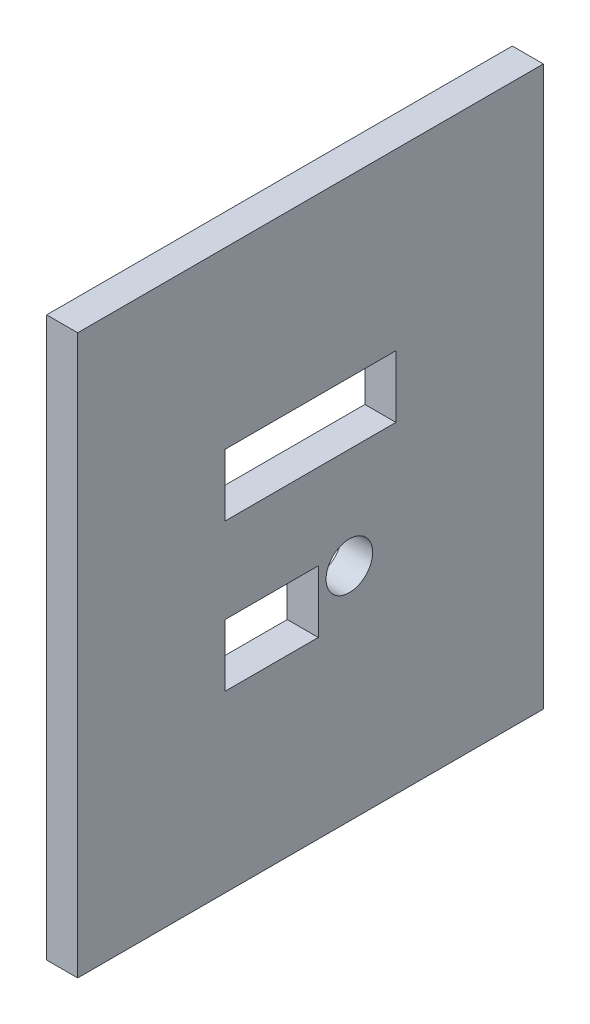
ISO-10303-21;
HEADER;
FILE_DESCRIPTION(('STEP AP214'),'2;1');
FILE_NAME('part.step','',(''),(''),'','','');
FILE_SCHEMA(('AUTOMOTIVE_DESIGN { 1 0 10303 214 1 1 1 1 }'));
ENDSEC;
DATA;
#1=APPLICATION_CONTEXT('core data for automotive mechanical design processes');
#2=APPLICATION_PROTOCOL_DEFINITION('international standard','automotive_design',2000,#1);
#3=PRODUCT_CONTEXT('',#1,'mechanical');
#4=PRODUCT('Part','Part','',(#3));
#5=PRODUCT_RELATED_PRODUCT_CATEGORY('part','',(#4));
#6=PRODUCT_DEFINITION_FORMATION('','',#4);
#7=PRODUCT_DEFINITION_CONTEXT('part definition',#1,'design');
#8=PRODUCT_DEFINITION('design','',#6,#7);
#9=PRODUCT_DEFINITION_SHAPE('','',#8);
#10=(LENGTH_UNIT() NAMED_UNIT(*) SI_UNIT(.MILLI.,.METRE.));
#11=(NAMED_UNIT(*) PLANE_ANGLE_UNIT() SI_UNIT($,.RADIAN.));
#12=(NAMED_UNIT(*) SI_UNIT($,.STERADIAN.) SOLID_ANGLE_UNIT());
#13=UNCERTAINTY_MEASURE_WITH_UNIT(LENGTH_MEASURE(1.E-05),#10,'distance_accuracy_value','');
#14=(GEOMETRIC_REPRESENTATION_CONTEXT(3) GLOBAL_UNCERTAINTY_ASSIGNED_CONTEXT((#13)) GLOBAL_UNIT_ASSIGNED_CONTEXT((#10,
#11,#12)) REPRESENTATION_CONTEXT('',''));
#15=CARTESIAN_POINT('',(0.,0.,0.));
#16=DIRECTION('',(0.,0.,1.));
#17=DIRECTION('',(1.,0.,0.));
#18=AXIS2_PLACEMENT_3D('',#15,#16,#17);
#19=CARTESIAN_POINT('',(2.,0.,0.));
#20=DIRECTION('',(1.,0.,0.));
#21=DIRECTION('',(0.,0.,-1.));
#22=AXIS2_PLACEMENT_3D('',#19,#20,#21);
#23=PLANE('',#22);
#24=CARTESIAN_POINT('',(2.,-3.75,-2.5));
#25=DIRECTION('',(1.,0.,0.));
#26=DIRECTION('',(0.,0.,-1.));
#27=AXIS2_PLACEMENT_3D('',#24,#25,#26);
#28=CIRCLE('',#27,1.5);
#29=CARTESIAN_POINT('',(2.,-3.75,-4.));
#30=VERTEX_POINT('',#29);
#31=EDGE_CURVE('E223',#30,#30,#28,.T.);
#32=ORIENTED_EDGE('',*,*,#31,.F.);
#33=EDGE_LOOP('',(#32));
#34=FACE_BOUND('',#33,.T.);
#35=DIRECTION('',(0.,1.,0.));
#36=VECTOR('',#35,1.);
#37=CARTESIAN_POINT('',(2.,0.,-0.5));
#38=LINE('',#37,#36);
#39=CARTESIAN_POINT('',(2.,-6.75,-0.5));
#40=VERTEX_POINT('',#39);
#41=CARTESIAN_POINT('',(2.,-2.75,-0.5));
#42=VERTEX_POINT('',#41);
#43=EDGE_CURVE('E49',#40,#42,#38,.T.);
#44=ORIENTED_EDGE('',*,*,#43,.F.);
#45=DIRECTION('',(0.,0.,1.));
#46=VECTOR('',#45,1.);
#47=CARTESIAN_POINT('',(2.,-6.75,0.));
#48=LINE('',#47,#46);
#49=CARTESIAN_POINT('',(2.,-6.75,5.5));
#50=VERTEX_POINT('',#49);
#51=EDGE_CURVE('E141',#40,#50,#48,.T.);
#52=ORIENTED_EDGE('',*,*,#51,.T.);
#53=DIRECTION('',(0.,1.,0.));
#54=VECTOR('',#53,1.);
#55=CARTESIAN_POINT('',(2.,0.,5.5));
#56=LINE('',#55,#54);
#57=CARTESIAN_POINT('',(2.,-2.75,5.5));
#58=VERTEX_POINT('',#57);
#59=EDGE_CURVE('E126',#50,#58,#56,.T.);
#60=ORIENTED_EDGE('',*,*,#59,.T.);
#61=DIRECTION('',(0.,0.,1.));
#62=VECTOR('',#61,1.);
#63=CARTESIAN_POINT('',(2.,-2.75,0.));
#64=LINE('',#63,#62);
#65=EDGE_CURVE('E135',#42,#58,#64,.T.);
#66=ORIENTED_EDGE('',*,*,#65,.F.);
#67=EDGE_LOOP('',(#44,#52,#60,#66));
#68=FACE_BOUND('',#67,.T.);
#69=DIRECTION('',(0.,-1.,0.));
#70=VECTOR('',#69,1.);
#71=CARTESIAN_POINT('',(2.,-18.,15.));
#72=LINE('',#71,#70);
#73=CARTESIAN_POINT('',(2.,18.,15.));
#74=VERTEX_POINT('',#73);
#75=CARTESIAN_POINT('',(2.,-18.,15.));
#76=VERTEX_POINT('',#75);
#77=EDGE_CURVE('E172',#74,#76,#72,.T.);
#78=ORIENTED_EDGE('',*,*,#77,.T.);
#79=DIRECTION('',(0.,0.,-1.));
#80=VECTOR('',#79,1.);
#81=CARTESIAN_POINT('',(2.,-18.,-15.));
#82=LINE('',#81,#80);
#83=CARTESIAN_POINT('',(2.,-18.,-15.));
#84=VERTEX_POINT('',#83);
#85=EDGE_CURVE('E175',#76,#84,#82,.T.);
#86=ORIENTED_EDGE('',*,*,#85,.T.);
#87=DIRECTION('',(0.,1.,0.));
#88=VECTOR('',#87,1.);
#89=CARTESIAN_POINT('',(2.,-18.,-15.));
#90=LINE('',#89,#88);
#91=CARTESIAN_POINT('',(2.,18.,-15.));
#92=VERTEX_POINT('',#91);
#93=EDGE_CURVE('E178',#84,#92,#90,.T.);
#94=ORIENTED_EDGE('',*,*,#93,.T.);
#95=DIRECTION('',(0.,0.,1.));
#96=VECTOR('',#95,1.);
#97=CARTESIAN_POINT('',(2.,18.,-15.));
#98=LINE('',#97,#96);
#99=EDGE_CURVE('E180',#92,#74,#98,.T.);
#100=ORIENTED_EDGE('',*,*,#99,.T.);
#101=EDGE_LOOP('',(#78,#86,#94,#100));
#102=FACE_BOUND('',#101,.T.);
#103=DIRECTION('',(0.,1.,0.));
#104=VECTOR('',#103,1.);
#105=CARTESIAN_POINT('',(2.,0.,-5.5));
#106=LINE('',#105,#104);
#107=CARTESIAN_POINT('',(2.,2.75,-5.5));
#108=VERTEX_POINT('',#107);
#109=CARTESIAN_POINT('',(2.,6.75,-5.5));
#110=VERTEX_POINT('',#109);
#111=EDGE_CURVE('E153',#108,#110,#106,.T.);
#112=ORIENTED_EDGE('',*,*,#111,.F.);
#113=DIRECTION('',(0.,0.,1.));
#114=VECTOR('',#113,1.);
#115=CARTESIAN_POINT('',(2.,2.75,0.));
#116=LINE('',#115,#114);
#117=CARTESIAN_POINT('',(2.,2.75,5.5));
#118=VERTEX_POINT('',#117);
#119=EDGE_CURVE('E148',#108,#118,#116,.T.);
#120=ORIENTED_EDGE('',*,*,#119,.T.);
#121=DIRECTION('',(0.,1.,0.));
#122=VECTOR('',#121,1.);
#123=CARTESIAN_POINT('',(2.,0.,5.5));
#124=LINE('',#123,#122);
#125=CARTESIAN_POINT('',(2.,6.75,5.5));
#126=VERTEX_POINT('',#125);
#127=EDGE_CURVE('E159',#118,#126,#124,.T.);
#128=ORIENTED_EDGE('',*,*,#127,.T.);
#129=DIRECTION('',(0.,0.,1.));
#130=VECTOR('',#129,1.);
#131=CARTESIAN_POINT('',(2.,6.75,0.));
#132=LINE('',#131,#130);
#133=EDGE_CURVE('E156',#110,#126,#132,.T.);
#134=ORIENTED_EDGE('',*,*,#133,.F.);
#135=EDGE_LOOP('',(#112,#120,#128,#134));
#136=FACE_BOUND('',#135,.T.);
#137=ADVANCED_FACE('F33',(#34,#68,#102,#136),#23,.T.);
#138=CARTESIAN_POINT('',(0.,0.,0.));
#139=DIRECTION('',(1.,0.,0.));
#140=DIRECTION('',(0.,0.,-1.));
#141=AXIS2_PLACEMENT_3D('',#138,#139,#140);
#142=PLANE('',#141);
#143=CARTESIAN_POINT('',(0.,-3.75,-2.5));
#144=DIRECTION('',(1.,0.,0.));
#145=DIRECTION('',(0.,0.,-1.));
#146=AXIS2_PLACEMENT_3D('',#143,#144,#145);
#147=CIRCLE('',#146,1.5);
#148=CARTESIAN_POINT('',(0.,-3.75,-4.));
#149=VERTEX_POINT('',#148);
#150=EDGE_CURVE('E37',#149,#149,#147,.T.);
#151=ORIENTED_EDGE('',*,*,#150,.T.);
#152=EDGE_LOOP('',(#151));
#153=FACE_BOUND('',#152,.T.);
#154=DIRECTION('',(0.,0.,1.));
#155=VECTOR('',#154,1.);
#156=CARTESIAN_POINT('',(0.,-6.75,0.));
#157=LINE('',#156,#155);
#158=CARTESIAN_POINT('',(0.,-6.75,-0.5));
#159=VERTEX_POINT('',#158);
#160=CARTESIAN_POINT('',(0.,-6.75,5.5));
#161=VERTEX_POINT('',#160);
#162=EDGE_CURVE('E42',#159,#161,#157,.T.);
#163=ORIENTED_EDGE('',*,*,#162,.F.);
#164=DIRECTION('',(0.,1.,0.));
#165=VECTOR('',#164,1.);
#166=CARTESIAN_POINT('',(0.,0.,-0.5));
#167=LINE('',#166,#165);
#168=CARTESIAN_POINT('',(0.,-2.75,-0.5));
#169=VERTEX_POINT('',#168);
#170=EDGE_CURVE('E11',#159,#169,#167,.T.);
#171=ORIENTED_EDGE('',*,*,#170,.T.);
#172=DIRECTION('',(0.,0.,1.));
#173=VECTOR('',#172,1.);
#174=CARTESIAN_POINT('',(0.,-2.75,0.));
#175=LINE('',#174,#173);
#176=CARTESIAN_POINT('',(0.,-2.75,5.5));
#177=VERTEX_POINT('',#176);
#178=EDGE_CURVE('E211',#169,#177,#175,.T.);
#179=ORIENTED_EDGE('',*,*,#178,.T.);
#180=DIRECTION('',(0.,1.,0.));
#181=VECTOR('',#180,1.);
#182=CARTESIAN_POINT('',(0.,0.,5.5));
#183=LINE('',#182,#181);
#184=EDGE_CURVE('E129',#161,#177,#183,.T.);
#185=ORIENTED_EDGE('',*,*,#184,.F.);
#186=EDGE_LOOP('',(#163,#171,#179,#185));
#187=FACE_BOUND('',#186,.T.);
#188=DIRECTION('',(0.,-1.,0.));
#189=VECTOR('',#188,1.);
#190=CARTESIAN_POINT('',(0.,-18.,15.));
#191=LINE('',#190,#189);
#192=CARTESIAN_POINT('',(0.,18.,15.));
#193=VERTEX_POINT('',#192);
#194=CARTESIAN_POINT('',(0.,-18.,15.));
#195=VERTEX_POINT('',#194);
#196=EDGE_CURVE('E165',#193,#195,#191,.T.);
#197=ORIENTED_EDGE('',*,*,#196,.F.);
#198=DIRECTION('',(0.,0.,1.));
#199=VECTOR('',#198,1.);
#200=CARTESIAN_POINT('',(0.,18.,-15.));
#201=LINE('',#200,#199);
#202=CARTESIAN_POINT('',(0.,18.,-15.));
#203=VERTEX_POINT('',#202);
#204=EDGE_CURVE('E176',#203,#193,#201,.T.);
#205=ORIENTED_EDGE('',*,*,#204,.F.);
#206=DIRECTION('',(0.,1.,0.));
#207=VECTOR('',#206,1.);
#208=CARTESIAN_POINT('',(0.,-18.,-15.));
#209=LINE('',#208,#207);
#210=CARTESIAN_POINT('',(0.,-18.,-15.));
#211=VERTEX_POINT('',#210);
#212=EDGE_CURVE('E187',#211,#203,#209,.T.);
#213=ORIENTED_EDGE('',*,*,#212,.F.);
#214=DIRECTION('',(0.,0.,-1.));
#215=VECTOR('',#214,1.);
#216=CARTESIAN_POINT('',(0.,-18.,-15.));
#217=LINE('',#216,#215);
#218=EDGE_CURVE('E185',#195,#211,#217,.T.);
#219=ORIENTED_EDGE('',*,*,#218,.F.);
#220=EDGE_LOOP('',(#197,#205,#213,#219));
#221=FACE_BOUND('',#220,.T.);
#222=DIRECTION('',(0.,0.,1.));
#223=VECTOR('',#222,1.);
#224=CARTESIAN_POINT('',(0.,2.75,0.));
#225=LINE('',#224,#223);
#226=CARTESIAN_POINT('',(0.,2.75,-5.5));
#227=VERTEX_POINT('',#226);
#228=CARTESIAN_POINT('',(0.,2.75,5.5));
#229=VERTEX_POINT('',#228);
#230=EDGE_CURVE('E209',#227,#229,#225,.T.);
#231=ORIENTED_EDGE('',*,*,#230,.F.);
#232=DIRECTION('',(0.,1.,0.));
#233=VECTOR('',#232,1.);
#234=CARTESIAN_POINT('',(0.,0.,-5.5));
#235=LINE('',#234,#233);
#236=CARTESIAN_POINT('',(0.,6.75,-5.5));
#237=VERTEX_POINT('',#236);
#238=EDGE_CURVE('E201',#227,#237,#235,.T.);
#239=ORIENTED_EDGE('',*,*,#238,.T.);
#240=DIRECTION('',(0.,0.,1.));
#241=VECTOR('',#240,1.);
#242=CARTESIAN_POINT('',(0.,6.75,0.));
#243=LINE('',#242,#241);
#244=CARTESIAN_POINT('',(0.,6.75,5.5));
#245=VERTEX_POINT('',#244);
#246=EDGE_CURVE('E204',#237,#245,#243,.T.);
#247=ORIENTED_EDGE('',*,*,#246,.T.);
#248=DIRECTION('',(0.,1.,0.));
#249=VECTOR('',#248,1.);
#250=CARTESIAN_POINT('',(0.,0.,5.5));
#251=LINE('',#250,#249);
#252=EDGE_CURVE('E207',#229,#245,#251,.T.);
#253=ORIENTED_EDGE('',*,*,#252,.F.);
#254=EDGE_LOOP('',(#231,#239,#247,#253));
#255=FACE_BOUND('',#254,.T.);
#256=ADVANCED_FACE('F219',(#153,#187,#221,#255),#142,.F.);
#257=CARTESIAN_POINT('',(2.,-18.,15.));
#258=DIRECTION('',(0.,0.,-1.));
#259=DIRECTION('',(-1.,0.,0.));
#260=AXIS2_PLACEMENT_3D('',#257,#258,#259);
#261=PLANE('',#260);
#262=ORIENTED_EDGE('',*,*,#196,.T.);
#263=DIRECTION('',(-1.,0.,0.));
#264=VECTOR('',#263,1.);
#265=CARTESIAN_POINT('',(2.,-18.,15.));
#266=LINE('',#265,#264);
#267=EDGE_CURVE('E198',#76,#195,#266,.T.);
#268=ORIENTED_EDGE('',*,*,#267,.F.);
#269=ORIENTED_EDGE('',*,*,#77,.F.);
#270=DIRECTION('',(-1.,0.,0.));
#271=VECTOR('',#270,1.);
#272=CARTESIAN_POINT('',(2.,18.,15.));
#273=LINE('',#272,#271);
#274=EDGE_CURVE('E182',#74,#193,#273,.T.);
#275=ORIENTED_EDGE('',*,*,#274,.T.);
#276=EDGE_LOOP('',(#262,#268,#269,#275));
#277=FACE_BOUND('',#276,.T.);
#278=ADVANCED_FACE('F35',(#277),#261,.F.);
#279=CARTESIAN_POINT('',(2.,-18.,-15.));
#280=DIRECTION('',(0.,1.,0.));
#281=DIRECTION('',(0.,0.,1.));
#282=AXIS2_PLACEMENT_3D('',#279,#280,#281);
#283=PLANE('',#282);
#284=ORIENTED_EDGE('',*,*,#218,.T.);
#285=DIRECTION('',(-1.,0.,0.));
#286=VECTOR('',#285,1.);
#287=CARTESIAN_POINT('',(2.,-18.,-15.));
#288=LINE('',#287,#286);
#289=EDGE_CURVE('E195',#84,#211,#288,.T.);
#290=ORIENTED_EDGE('',*,*,#289,.F.);
#291=ORIENTED_EDGE('',*,*,#85,.F.);
#292=ORIENTED_EDGE('',*,*,#267,.T.);
#293=EDGE_LOOP('',(#284,#290,#291,#292));
#294=FACE_BOUND('',#293,.T.);
#295=ADVANCED_FACE('F248',(#294),#283,.F.);
#296=CARTESIAN_POINT('',(2.,-18.,-15.));
#297=DIRECTION('',(0.,0.,1.));
#298=DIRECTION('',(1.,0.,0.));
#299=AXIS2_PLACEMENT_3D('',#296,#297,#298);
#300=PLANE('',#299);
#301=ORIENTED_EDGE('',*,*,#212,.T.);
#302=DIRECTION('',(-1.,0.,0.));
#303=VECTOR('',#302,1.);
#304=CARTESIAN_POINT('',(2.,18.,-15.));
#305=LINE('',#304,#303);
#306=EDGE_CURVE('E192',#92,#203,#305,.T.);
#307=ORIENTED_EDGE('',*,*,#306,.F.);
#308=ORIENTED_EDGE('',*,*,#93,.F.);
#309=ORIENTED_EDGE('',*,*,#289,.T.);
#310=EDGE_LOOP('',(#301,#307,#308,#309));
#311=FACE_BOUND('',#310,.T.);
#312=ADVANCED_FACE('F245',(#311),#300,.F.);
#313=CARTESIAN_POINT('',(2.,18.,-15.));
#314=DIRECTION('',(0.,-1.,0.));
#315=DIRECTION('',(0.,0.,-1.));
#316=AXIS2_PLACEMENT_3D('',#313,#314,#315);
#317=PLANE('',#316);
#318=ORIENTED_EDGE('',*,*,#204,.T.);
#319=ORIENTED_EDGE('',*,*,#274,.F.);
#320=ORIENTED_EDGE('',*,*,#99,.F.);
#321=ORIENTED_EDGE('',*,*,#306,.T.);
#322=EDGE_LOOP('',(#318,#319,#320,#321));
#323=FACE_BOUND('',#322,.T.);
#324=ADVANCED_FACE('F242',(#323),#317,.F.);
#325=CARTESIAN_POINT('',(-8.,2.75,0.));
#326=DIRECTION('',(0.,1.,0.));
#327=DIRECTION('',(0.,0.,1.));
#328=AXIS2_PLACEMENT_3D('',#325,#326,#327);
#329=PLANE('',#328);
#330=ORIENTED_EDGE('',*,*,#230,.T.);
#331=DIRECTION('',(1.,0.,0.));
#332=VECTOR('',#331,1.);
#333=CARTESIAN_POINT('',(-8.,2.75,5.5));
#334=LINE('',#333,#332);
#335=EDGE_CURVE('E163',#229,#118,#334,.T.);
#336=ORIENTED_EDGE('',*,*,#335,.T.);
#337=ORIENTED_EDGE('',*,*,#119,.F.);
#338=DIRECTION('',(1.,0.,0.));
#339=VECTOR('',#338,1.);
#340=CARTESIAN_POINT('',(-8.,2.75,-5.5));
#341=LINE('',#340,#339);
#342=EDGE_CURVE('E162',#227,#108,#341,.T.);
#343=ORIENTED_EDGE('',*,*,#342,.F.);
#344=EDGE_LOOP('',(#330,#336,#337,#343));
#345=FACE_BOUND('',#344,.T.);
#346=ADVANCED_FACE('F239',(#345),#329,.T.);
#347=CARTESIAN_POINT('',(-8.,0.,5.5));
#348=DIRECTION('',(0.,0.,-1.));
#349=DIRECTION('',(-1.,0.,0.));
#350=AXIS2_PLACEMENT_3D('',#347,#348,#349);
#351=PLANE('',#350);
#352=ORIENTED_EDGE('',*,*,#252,.T.);
#353=DIRECTION('',(1.,0.,0.));
#354=VECTOR('',#353,1.);
#355=CARTESIAN_POINT('',(-8.,6.75,5.5));
#356=LINE('',#355,#354);
#357=EDGE_CURVE('E166',#245,#126,#356,.T.);
#358=ORIENTED_EDGE('',*,*,#357,.T.);
#359=ORIENTED_EDGE('',*,*,#127,.F.);
#360=ORIENTED_EDGE('',*,*,#335,.F.);
#361=EDGE_LOOP('',(#352,#358,#359,#360));
#362=FACE_BOUND('',#361,.T.);
#363=ADVANCED_FACE('F280',(#362),#351,.T.);
#364=CARTESIAN_POINT('',(-8.,6.75,0.));
#365=DIRECTION('',(0.,1.,0.));
#366=DIRECTION('',(0.,0.,1.));
#367=AXIS2_PLACEMENT_3D('',#364,#365,#366);
#368=PLANE('',#367);
#369=DIRECTION('',(1.,0.,0.));
#370=VECTOR('',#369,1.);
#371=CARTESIAN_POINT('',(-8.,6.75,-5.5));
#372=LINE('',#371,#370);
#373=EDGE_CURVE('E168',#237,#110,#372,.T.);
#374=ORIENTED_EDGE('',*,*,#373,.T.);
#375=ORIENTED_EDGE('',*,*,#133,.T.);
#376=ORIENTED_EDGE('',*,*,#357,.F.);
#377=ORIENTED_EDGE('',*,*,#246,.F.);
#378=EDGE_LOOP('',(#374,#375,#376,#377));
#379=FACE_BOUND('',#378,.T.);
#380=ADVANCED_FACE('F283',(#379),#368,.F.);
#381=CARTESIAN_POINT('',(-8.,0.,-5.5));
#382=DIRECTION('',(0.,0.,-1.));
#383=DIRECTION('',(-1.,0.,0.));
#384=AXIS2_PLACEMENT_3D('',#381,#382,#383);
#385=PLANE('',#384);
#386=ORIENTED_EDGE('',*,*,#342,.T.);
#387=ORIENTED_EDGE('',*,*,#111,.T.);
#388=ORIENTED_EDGE('',*,*,#373,.F.);
#389=ORIENTED_EDGE('',*,*,#238,.F.);
#390=EDGE_LOOP('',(#386,#387,#388,#389));
#391=FACE_BOUND('',#390,.T.);
#392=ADVANCED_FACE('F271',(#391),#385,.F.);
#393=CARTESIAN_POINT('',(-8.,0.,-0.5));
#394=DIRECTION('',(0.,0.,-1.));
#395=DIRECTION('',(-1.,0.,0.));
#396=AXIS2_PLACEMENT_3D('',#393,#394,#395);
#397=PLANE('',#396);
#398=DIRECTION('',(1.,0.,0.));
#399=VECTOR('',#398,1.);
#400=CARTESIAN_POINT('',(-8.,-6.75,-0.5));
#401=LINE('',#400,#399);
#402=EDGE_CURVE('E146',#159,#40,#401,.T.);
#403=ORIENTED_EDGE('',*,*,#402,.T.);
#404=ORIENTED_EDGE('',*,*,#43,.T.);
#405=DIRECTION('',(1.,0.,0.));
#406=VECTOR('',#405,1.);
#407=CARTESIAN_POINT('',(-8.,-2.75,-0.5));
#408=LINE('',#407,#406);
#409=EDGE_CURVE('E132',#169,#42,#408,.T.);
#410=ORIENTED_EDGE('',*,*,#409,.F.);
#411=ORIENTED_EDGE('',*,*,#170,.F.);
#412=EDGE_LOOP('',(#403,#404,#410,#411));
#413=FACE_BOUND('',#412,.T.);
#414=ADVANCED_FACE('F221',(#413),#397,.F.);
#415=CARTESIAN_POINT('',(-8.,-6.75,0.));
#416=DIRECTION('',(0.,1.,0.));
#417=DIRECTION('',(0.,0.,1.));
#418=AXIS2_PLACEMENT_3D('',#415,#416,#417);
#419=PLANE('',#418);
#420=ORIENTED_EDGE('',*,*,#162,.T.);
#421=DIRECTION('',(1.,0.,0.));
#422=VECTOR('',#421,1.);
#423=CARTESIAN_POINT('',(-8.,-6.75,5.5));
#424=LINE('',#423,#422);
#425=EDGE_CURVE('E131',#161,#50,#424,.T.);
#426=ORIENTED_EDGE('',*,*,#425,.T.);
#427=ORIENTED_EDGE('',*,*,#51,.F.);
#428=ORIENTED_EDGE('',*,*,#402,.F.);
#429=EDGE_LOOP('',(#420,#426,#427,#428));
#430=FACE_BOUND('',#429,.T.);
#431=ADVANCED_FACE('F217',(#430),#419,.T.);
#432=CARTESIAN_POINT('',(-8.,0.,5.5));
#433=DIRECTION('',(0.,0.,-1.));
#434=DIRECTION('',(-1.,0.,0.));
#435=AXIS2_PLACEMENT_3D('',#432,#433,#434);
#436=PLANE('',#435);
#437=ORIENTED_EDGE('',*,*,#184,.T.);
#438=DIRECTION('',(1.,0.,0.));
#439=VECTOR('',#438,1.);
#440=CARTESIAN_POINT('',(-8.,-2.75,5.5));
#441=LINE('',#440,#439);
#442=EDGE_CURVE('E57',#177,#58,#441,.T.);
#443=ORIENTED_EDGE('',*,*,#442,.T.);
#444=ORIENTED_EDGE('',*,*,#59,.F.);
#445=ORIENTED_EDGE('',*,*,#425,.F.);
#446=EDGE_LOOP('',(#437,#443,#444,#445));
#447=FACE_BOUND('',#446,.T.);
#448=ADVANCED_FACE('F123',(#447),#436,.T.);
#449=CARTESIAN_POINT('',(-8.,-2.75,0.));
#450=DIRECTION('',(0.,1.,0.));
#451=DIRECTION('',(0.,0.,1.));
#452=AXIS2_PLACEMENT_3D('',#449,#450,#451);
#453=PLANE('',#452);
#454=ORIENTED_EDGE('',*,*,#409,.T.);
#455=ORIENTED_EDGE('',*,*,#65,.T.);
#456=ORIENTED_EDGE('',*,*,#442,.F.);
#457=ORIENTED_EDGE('',*,*,#178,.F.);
#458=EDGE_LOOP('',(#454,#455,#456,#457));
#459=FACE_BOUND('',#458,.T.);
#460=ADVANCED_FACE('F136',(#459),#453,.F.);
#461=CARTESIAN_POINT('',(-8.,-3.75,-2.5));
#462=DIRECTION('',(1.,0.,0.));
#463=DIRECTION('',(0.,0.,-1.));
#464=AXIS2_PLACEMENT_3D('',#461,#462,#463);
#465=CYLINDRICAL_SURFACE('',#464,1.5);
#466=ORIENTED_EDGE('',*,*,#31,.T.);
#467=EDGE_LOOP('',(#466));
#468=FACE_BOUND('',#467,.T.);
#469=ORIENTED_EDGE('',*,*,#150,.F.);
#470=EDGE_LOOP('',(#469));
#471=FACE_BOUND('',#470,.T.);
#472=ADVANCED_FACE('F228',(#468,#471),#465,.F.);
#473=CLOSED_SHELL('',(#137,#256,#278,#295,#312,#324,#346,#363,#380,#392,#414,#431,#448,#460,#472));
#474=MANIFOLD_SOLID_BREP('B2',#473);
#475=ADVANCED_BREP_SHAPE_REPRESENTATION('',(#18,#474),#14);
#476=SHAPE_DEFINITION_REPRESENTATION(#9,#475);
ENDSEC;
END-ISO-10303-21;
